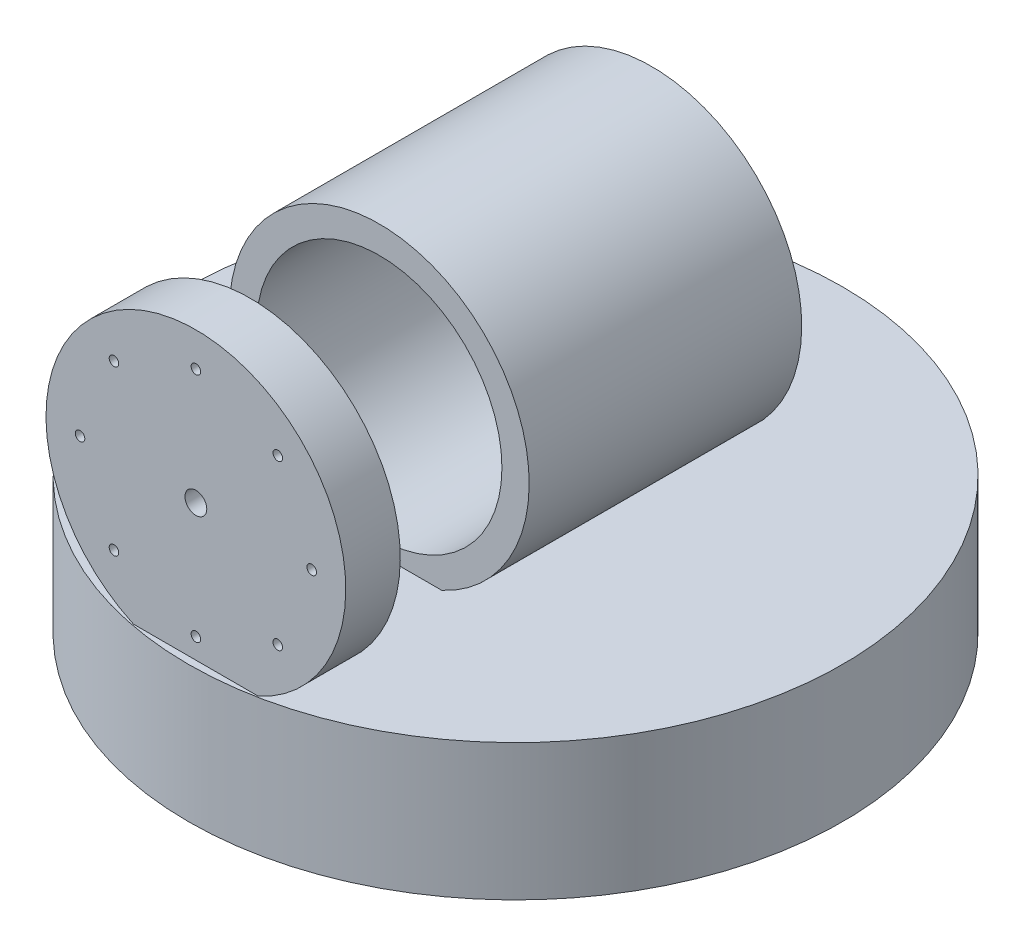
ISO-10303-21;
HEADER;
FILE_DESCRIPTION(('STEP AP214'),'2;1');
FILE_NAME('part.step','',(''),(''),'','','');
FILE_SCHEMA(('AUTOMOTIVE_DESIGN { 1 0 10303 214 1 1 1 1 }'));
ENDSEC;
DATA;
#1=APPLICATION_CONTEXT('core data for automotive mechanical design processes');
#2=APPLICATION_PROTOCOL_DEFINITION('international standard','automotive_design',2000,#1);
#3=PRODUCT_CONTEXT('',#1,'mechanical');
#4=PRODUCT('Part','Part','',(#3));
#5=PRODUCT_RELATED_PRODUCT_CATEGORY('part','',(#4));
#6=PRODUCT_DEFINITION_FORMATION('','',#4);
#7=PRODUCT_DEFINITION_CONTEXT('part definition',#1,'design');
#8=PRODUCT_DEFINITION('design','',#6,#7);
#9=PRODUCT_DEFINITION_SHAPE('','',#8);
#10=(LENGTH_UNIT() NAMED_UNIT(*) SI_UNIT(.MILLI.,.METRE.));
#11=(NAMED_UNIT(*) PLANE_ANGLE_UNIT() SI_UNIT($,.RADIAN.));
#12=(NAMED_UNIT(*) SI_UNIT($,.STERADIAN.) SOLID_ANGLE_UNIT());
#13=UNCERTAINTY_MEASURE_WITH_UNIT(LENGTH_MEASURE(1.E-05),#10,'distance_accuracy_value','');
#14=(GEOMETRIC_REPRESENTATION_CONTEXT(3) GLOBAL_UNCERTAINTY_ASSIGNED_CONTEXT((#13)) GLOBAL_UNIT_ASSIGNED_CONTEXT((#10,
#11,#12)) REPRESENTATION_CONTEXT('',''));
#15=CARTESIAN_POINT('',(0.,0.,0.));
#16=DIRECTION('',(0.,0.,1.));
#17=DIRECTION('',(1.,0.,0.));
#18=AXIS2_PLACEMENT_3D('',#15,#16,#17);
#19=CARTESIAN_POINT('',(0.,50.,0.));
#20=DIRECTION('',(0.,1.,0.));
#21=DIRECTION('',(0.,0.,1.));
#22=AXIS2_PLACEMENT_3D('',#19,#20,#21);
#23=PLANE('',#22);
#24=DIRECTION('',(1.,0.,0.));
#25=VECTOR('',#24,1.);
#26=CARTESIAN_POINT('',(0.,50.,117.3));
#27=LINE('',#26,#25);
#28=CARTESIAN_POINT('',(-22.9128784747792,50.,117.3));
#29=VERTEX_POINT('',#28);
#30=CARTESIAN_POINT('',(22.9128784747792,50.,117.3));
#31=VERTEX_POINT('',#30);
#32=EDGE_CURVE('E12',#29,#31,#27,.T.);
#33=ORIENTED_EDGE('',*,*,#32,.F.);
#34=DIRECTION('',(0.,0.,-1.));
#35=VECTOR('',#34,1.);
#36=CARTESIAN_POINT('',(-22.9128784747792,50.,117.3));
#37=LINE('',#36,#35);
#38=CARTESIAN_POINT('',(-22.9128784747792,50.,97.3));
#39=VERTEX_POINT('',#38);
#40=EDGE_CURVE('E96',#29,#39,#37,.T.);
#41=ORIENTED_EDGE('',*,*,#40,.T.);
#42=DIRECTION('',(1.,0.,0.));
#43=VECTOR('',#42,1.);
#44=CARTESIAN_POINT('',(0.,50.,97.3));
#45=LINE('',#44,#43);
#46=CARTESIAN_POINT('',(22.9128784747792,50.,97.3));
#47=VERTEX_POINT('',#46);
#48=EDGE_CURVE('E91',#39,#47,#45,.T.);
#49=ORIENTED_EDGE('',*,*,#48,.T.);
#50=DIRECTION('',(0.,0.,-1.));
#51=VECTOR('',#50,1.);
#52=CARTESIAN_POINT('',(22.9128784747792,50.,117.3));
#53=LINE('',#52,#51);
#54=EDGE_CURVE('E61',#47,#31,#53,.F.);
#55=ORIENTED_EDGE('',*,*,#54,.T.);
#56=EDGE_LOOP('',(#33,#41,#49,#55));
#57=FACE_BOUND('',#56,.T.);
#58=CARTESIAN_POINT('',(0.,50.,0.));
#59=DIRECTION('',(0.,1.,0.));
#60=DIRECTION('',(0.,0.,1.));
#61=AXIS2_PLACEMENT_3D('',#58,#59,#60);
#62=CIRCLE('',#61,120.);
#63=CARTESIAN_POINT('',(0.,50.,120.));
#64=VERTEX_POINT('',#63);
#65=EDGE_CURVE('E118',#64,#64,#62,.T.);
#66=ORIENTED_EDGE('',*,*,#65,.T.);
#67=EDGE_LOOP('',(#66));
#68=FACE_BOUND('',#67,.T.);
#69=DIRECTION('',(0.,0.,1.));
#70=VECTOR('',#69,1.);
#71=CARTESIAN_POINT('',(-22.9128784747792,50.,-50.));
#72=LINE('',#71,#70);
#73=CARTESIAN_POINT('',(-22.9128784747792,50.,-50.));
#74=VERTEX_POINT('',#73);
#75=CARTESIAN_POINT('',(-22.9128784747792,50.,50.));
#76=VERTEX_POINT('',#75);
#77=EDGE_CURVE('E75',#74,#76,#72,.T.);
#78=ORIENTED_EDGE('',*,*,#77,.F.);
#79=DIRECTION('',(1.,0.,0.));
#80=VECTOR('',#79,1.);
#81=CARTESIAN_POINT('',(0.,50.,-50.));
#82=LINE('',#81,#80);
#83=CARTESIAN_POINT('',(22.9128784747792,50.,-50.));
#84=VERTEX_POINT('',#83);
#85=EDGE_CURVE('E97',#74,#84,#82,.T.);
#86=ORIENTED_EDGE('',*,*,#85,.T.);
#87=DIRECTION('',(0.,0.,1.));
#88=VECTOR('',#87,1.);
#89=CARTESIAN_POINT('',(22.9128784747792,50.,-50.));
#90=LINE('',#89,#88);
#91=CARTESIAN_POINT('',(22.9128784747792,50.,50.));
#92=VERTEX_POINT('',#91);
#93=EDGE_CURVE('E112',#92,#84,#90,.F.);
#94=ORIENTED_EDGE('',*,*,#93,.F.);
#95=DIRECTION('',(1.,0.,0.));
#96=VECTOR('',#95,1.);
#97=CARTESIAN_POINT('',(0.,50.,50.));
#98=LINE('',#97,#96);
#99=EDGE_CURVE('E115',#76,#92,#98,.T.);
#100=ORIENTED_EDGE('',*,*,#99,.F.);
#101=EDGE_LOOP('',(#78,#86,#94,#100));
#102=FACE_BOUND('',#101,.T.);
#103=ADVANCED_FACE('F53',(#57,#68,#102),#23,.T.);
#104=CARTESIAN_POINT('',(0.,50.,0.));
#105=DIRECTION('',(0.,-1.,0.));
#106=DIRECTION('',(0.,0.,-1.));
#107=AXIS2_PLACEMENT_3D('',#104,#105,#106);
#108=CYLINDRICAL_SURFACE('',#107,120.);
#109=ORIENTED_EDGE('',*,*,#65,.F.);
#110=EDGE_LOOP('',(#109));
#111=FACE_BOUND('',#110,.T.);
#112=CARTESIAN_POINT('',(0.,0.,0.));
#113=DIRECTION('',(0.,1.,0.));
#114=DIRECTION('',(0.,0.,1.));
#115=AXIS2_PLACEMENT_3D('',#112,#113,#114);
#116=CIRCLE('',#115,120.);
#117=CARTESIAN_POINT('',(0.,0.,120.));
#118=VERTEX_POINT('',#117);
#119=EDGE_CURVE('E119',#118,#118,#116,.T.);
#120=ORIENTED_EDGE('',*,*,#119,.T.);
#121=EDGE_LOOP('',(#120));
#122=FACE_BOUND('',#121,.T.);
#123=ADVANCED_FACE('F55',(#111,#122),#108,.T.);
#124=CARTESIAN_POINT('',(0.,0.,0.));
#125=DIRECTION('',(0.,1.,0.));
#126=DIRECTION('',(0.,0.,1.));
#127=AXIS2_PLACEMENT_3D('',#124,#125,#126);
#128=PLANE('',#127);
#129=CARTESIAN_POINT('',(17.25,0.,0.));
#130=DIRECTION('',(0.,-1.,0.));
#131=DIRECTION('',(0.,0.,-1.));
#132=AXIS2_PLACEMENT_3D('',#129,#130,#131);
#133=CIRCLE('',#132,2.);
#134=CARTESIAN_POINT('',(17.25,0.,-2.));
#135=VERTEX_POINT('',#134);
#136=EDGE_CURVE('E162',#135,#135,#133,.T.);
#137=ORIENTED_EDGE('',*,*,#136,.F.);
#138=EDGE_LOOP('',(#137));
#139=FACE_BOUND('',#138,.T.);
#140=CARTESIAN_POINT('',(8.62500000000018,0.,14.9389382152815));
#141=DIRECTION('',(0.,-1.,0.));
#142=DIRECTION('',(0.,0.,-1.));
#143=AXIS2_PLACEMENT_3D('',#140,#141,#142);
#144=CIRCLE('',#143,2.);
#145=CARTESIAN_POINT('',(8.62500000000018,0.,12.9389382152815));
#146=VERTEX_POINT('',#145);
#147=EDGE_CURVE('E141',#146,#146,#144,.T.);
#148=ORIENTED_EDGE('',*,*,#147,.F.);
#149=EDGE_LOOP('',(#148));
#150=FACE_BOUND('',#149,.T.);
#151=CARTESIAN_POINT('',(-8.62499999999986,0.,14.9389382152816));
#152=DIRECTION('',(0.,-1.,0.));
#153=DIRECTION('',(0.,0.,-1.));
#154=AXIS2_PLACEMENT_3D('',#151,#152,#153);
#155=CIRCLE('',#154,2.);
#156=CARTESIAN_POINT('',(-8.62499999999986,0.,12.9389382152816));
#157=VERTEX_POINT('',#156);
#158=EDGE_CURVE('E140',#157,#157,#155,.T.);
#159=ORIENTED_EDGE('',*,*,#158,.F.);
#160=EDGE_LOOP('',(#159));
#161=FACE_BOUND('',#160,.T.);
#162=CARTESIAN_POINT('',(-17.25,0.,1.20456106190088E-13));
#163=DIRECTION('',(0.,-1.,0.));
#164=DIRECTION('',(0.,0.,-1.));
#165=AXIS2_PLACEMENT_3D('',#162,#163,#164);
#166=CIRCLE('',#165,2.);
#167=CARTESIAN_POINT('',(-17.25,0.,-1.99999999999988));
#168=VERTEX_POINT('',#167);
#169=EDGE_CURVE('E147',#168,#168,#166,.T.);
#170=ORIENTED_EDGE('',*,*,#169,.F.);
#171=EDGE_LOOP('',(#170));
#172=FACE_BOUND('',#171,.T.);
#173=CARTESIAN_POINT('',(-8.62500000000007,0.,-14.9389382152815));
#174=DIRECTION('',(0.,-1.,0.));
#175=DIRECTION('',(0.,0.,-1.));
#176=AXIS2_PLACEMENT_3D('',#173,#174,#175);
#177=CIRCLE('',#176,2.);
#178=CARTESIAN_POINT('',(-8.62500000000007,0.,-16.9389382152815));
#179=VERTEX_POINT('',#178);
#180=EDGE_CURVE('E153',#179,#179,#177,.T.);
#181=ORIENTED_EDGE('',*,*,#180,.F.);
#182=EDGE_LOOP('',(#181));
#183=FACE_BOUND('',#182,.T.);
#184=CARTESIAN_POINT('',(8.62499999999997,0.,-14.9389382152816));
#185=DIRECTION('',(0.,-1.,0.));
#186=DIRECTION('',(0.,0.,-1.));
#187=AXIS2_PLACEMENT_3D('',#184,#185,#186);
#188=CIRCLE('',#187,2.);
#189=CARTESIAN_POINT('',(8.62499999999997,0.,-16.9389382152816));
#190=VERTEX_POINT('',#189);
#191=EDGE_CURVE('E159',#190,#190,#188,.T.);
#192=ORIENTED_EDGE('',*,*,#191,.F.);
#193=EDGE_LOOP('',(#192));
#194=FACE_BOUND('',#193,.T.);
#195=ORIENTED_EDGE('',*,*,#119,.F.);
#196=EDGE_LOOP('',(#195));
#197=FACE_BOUND('',#196,.T.);
#198=ADVANCED_FACE('F262',(#139,#150,#161,#172,#183,#194,#197),#128,.F.);
#199=CARTESIAN_POINT('',(0.,100.,-50.));
#200=DIRECTION('',(0.,0.,1.));
#201=DIRECTION('',(1.,0.,0.));
#202=AXIS2_PLACEMENT_3D('',#199,#200,#201);
#203=CYLINDRICAL_SURFACE('',#202,55.);
#204=CARTESIAN_POINT('',(0.,100.,-50.));
#205=DIRECTION('',(0.,0.,1.));
#206=DIRECTION('',(1.,0.,0.));
#207=AXIS2_PLACEMENT_3D('',#204,#205,#206);
#208=CIRCLE('',#207,55.);
#209=EDGE_CURVE('E122',#84,#74,#208,.T.);
#210=ORIENTED_EDGE('',*,*,#209,.T.);
#211=ORIENTED_EDGE('',*,*,#77,.T.);
#212=CARTESIAN_POINT('',(0.,100.,50.));
#213=DIRECTION('',(0.,0.,1.));
#214=DIRECTION('',(1.,0.,0.));
#215=AXIS2_PLACEMENT_3D('',#212,#213,#214);
#216=CIRCLE('',#215,55.);
#217=EDGE_CURVE('E130',#92,#76,#216,.T.);
#218=ORIENTED_EDGE('',*,*,#217,.F.);
#219=ORIENTED_EDGE('',*,*,#93,.T.);
#220=EDGE_LOOP('',(#210,#211,#218,#219));
#221=FACE_BOUND('',#220,.T.);
#222=ADVANCED_FACE('F265',(#221),#203,.T.);
#223=CARTESIAN_POINT('',(0.,100.,-50.));
#224=DIRECTION('',(0.,0.,1.));
#225=DIRECTION('',(1.,0.,0.));
#226=AXIS2_PLACEMENT_3D('',#223,#224,#225);
#227=PLANE('',#226);
#228=ORIENTED_EDGE('',*,*,#85,.F.);
#229=ORIENTED_EDGE('',*,*,#209,.F.);
#230=EDGE_LOOP('',(#228,#229));
#231=FACE_BOUND('',#230,.T.);
#232=CARTESIAN_POINT('',(0.,100.,-50.));
#233=DIRECTION('',(0.,0.,1.));
#234=DIRECTION('',(1.,0.,0.));
#235=AXIS2_PLACEMENT_3D('',#232,#233,#234);
#236=CIRCLE('',#235,45.);
#237=CARTESIAN_POINT('',(45.,100.,-50.));
#238=VERTEX_POINT('',#237);
#239=EDGE_CURVE('E127',#238,#238,#236,.T.);
#240=ORIENTED_EDGE('',*,*,#239,.T.);
#241=EDGE_LOOP('',(#240));
#242=FACE_BOUND('',#241,.T.);
#243=ADVANCED_FACE('F274',(#231,#242),#227,.F.);
#244=CARTESIAN_POINT('',(0.,100.,-50.));
#245=DIRECTION('',(0.,0.,1.));
#246=DIRECTION('',(1.,0.,0.));
#247=AXIS2_PLACEMENT_3D('',#244,#245,#246);
#248=CYLINDRICAL_SURFACE('',#247,45.);
#249=ORIENTED_EDGE('',*,*,#239,.F.);
#250=EDGE_LOOP('',(#249));
#251=FACE_BOUND('',#250,.T.);
#252=CARTESIAN_POINT('',(0.,100.,50.));
#253=DIRECTION('',(0.,0.,1.));
#254=DIRECTION('',(1.,0.,0.));
#255=AXIS2_PLACEMENT_3D('',#252,#253,#254);
#256=CIRCLE('',#255,45.);
#257=CARTESIAN_POINT('',(45.,100.,50.));
#258=VERTEX_POINT('',#257);
#259=EDGE_CURVE('E133',#258,#258,#256,.T.);
#260=ORIENTED_EDGE('',*,*,#259,.T.);
#261=EDGE_LOOP('',(#260));
#262=FACE_BOUND('',#261,.T.);
#263=ADVANCED_FACE('F302',(#251,#262),#248,.F.);
#264=CARTESIAN_POINT('',(0.,100.,50.));
#265=DIRECTION('',(0.,0.,1.));
#266=DIRECTION('',(1.,0.,0.));
#267=AXIS2_PLACEMENT_3D('',#264,#265,#266);
#268=PLANE('',#267);
#269=ORIENTED_EDGE('',*,*,#217,.T.);
#270=ORIENTED_EDGE('',*,*,#99,.T.);
#271=EDGE_LOOP('',(#269,#270));
#272=FACE_BOUND('',#271,.T.);
#273=ORIENTED_EDGE('',*,*,#259,.F.);
#274=EDGE_LOOP('',(#273));
#275=FACE_BOUND('',#274,.T.);
#276=ADVANCED_FACE('F293',(#272,#275),#268,.T.);
#277=CARTESIAN_POINT('',(8.62499999999997,3.,-14.9389382152816));
#278=DIRECTION('',(0.,-1.,0.));
#279=DIRECTION('',(0.,0.,-1.));
#280=AXIS2_PLACEMENT_3D('',#277,#278,#279);
#281=CYLINDRICAL_SURFACE('',#280,2.);
#282=CARTESIAN_POINT('',(8.62499999999997,3.,-14.9389382152816));
#283=DIRECTION('',(0.,-1.,0.));
#284=DIRECTION('',(0.,0.,-1.));
#285=AXIS2_PLACEMENT_3D('',#282,#283,#284);
#286=CIRCLE('',#285,2.);
#287=CARTESIAN_POINT('',(8.62499999999997,3.,-16.9389382152816));
#288=VERTEX_POINT('',#287);
#289=EDGE_CURVE('E156',#288,#288,#286,.T.);
#290=ORIENTED_EDGE('',*,*,#289,.F.);
#291=EDGE_LOOP('',(#290));
#292=FACE_BOUND('',#291,.T.);
#293=ORIENTED_EDGE('',*,*,#191,.T.);
#294=EDGE_LOOP('',(#293));
#295=FACE_BOUND('',#294,.T.);
#296=ADVANCED_FACE('F291',(#292,#295),#281,.F.);
#297=CARTESIAN_POINT('',(8.62499999999997,3.,-14.9389382152816));
#298=DIRECTION('',(0.,-1.,0.));
#299=DIRECTION('',(0.,0.,-1.));
#300=AXIS2_PLACEMENT_3D('',#297,#298,#299);
#301=PLANE('',#300);
#302=ORIENTED_EDGE('',*,*,#289,.T.);
#303=EDGE_LOOP('',(#302));
#304=FACE_BOUND('',#303,.T.);
#305=ADVANCED_FACE('F292',(#304),#301,.T.);
#306=CARTESIAN_POINT('',(-8.62500000000007,3.,-14.9389382152815));
#307=DIRECTION('',(0.,-1.,0.));
#308=DIRECTION('',(0.,0.,-1.));
#309=AXIS2_PLACEMENT_3D('',#306,#307,#308);
#310=CYLINDRICAL_SURFACE('',#309,2.);
#311=CARTESIAN_POINT('',(-8.62500000000007,3.,-14.9389382152815));
#312=DIRECTION('',(0.,-1.,0.));
#313=DIRECTION('',(0.,0.,-1.));
#314=AXIS2_PLACEMENT_3D('',#311,#312,#313);
#315=CIRCLE('',#314,2.);
#316=CARTESIAN_POINT('',(-8.62500000000007,3.,-16.9389382152815));
#317=VERTEX_POINT('',#316);
#318=EDGE_CURVE('E150',#317,#317,#315,.T.);
#319=ORIENTED_EDGE('',*,*,#318,.F.);
#320=EDGE_LOOP('',(#319));
#321=FACE_BOUND('',#320,.T.);
#322=ORIENTED_EDGE('',*,*,#180,.T.);
#323=EDGE_LOOP('',(#322));
#324=FACE_BOUND('',#323,.T.);
#325=ADVANCED_FACE('F299',(#321,#324),#310,.F.);
#326=CARTESIAN_POINT('',(-8.62500000000007,3.,-14.9389382152815));
#327=DIRECTION('',(0.,-1.,0.));
#328=DIRECTION('',(0.,0.,-1.));
#329=AXIS2_PLACEMENT_3D('',#326,#327,#328);
#330=PLANE('',#329);
#331=ORIENTED_EDGE('',*,*,#318,.T.);
#332=EDGE_LOOP('',(#331));
#333=FACE_BOUND('',#332,.T.);
#334=ADVANCED_FACE('F312',(#333),#330,.T.);
#335=CARTESIAN_POINT('',(-17.25,3.,1.20456106190088E-13));
#336=DIRECTION('',(0.,-1.,0.));
#337=DIRECTION('',(0.,0.,-1.));
#338=AXIS2_PLACEMENT_3D('',#335,#336,#337);
#339=CYLINDRICAL_SURFACE('',#338,2.);
#340=CARTESIAN_POINT('',(-17.25,3.,1.20456106190088E-13));
#341=DIRECTION('',(0.,-1.,0.));
#342=DIRECTION('',(0.,0.,-1.));
#343=AXIS2_PLACEMENT_3D('',#340,#341,#342);
#344=CIRCLE('',#343,2.);
#345=CARTESIAN_POINT('',(-17.25,3.,-1.99999999999988));
#346=VERTEX_POINT('',#345);
#347=EDGE_CURVE('E144',#346,#346,#344,.T.);
#348=ORIENTED_EDGE('',*,*,#347,.F.);
#349=EDGE_LOOP('',(#348));
#350=FACE_BOUND('',#349,.T.);
#351=ORIENTED_EDGE('',*,*,#169,.T.);
#352=EDGE_LOOP('',(#351));
#353=FACE_BOUND('',#352,.T.);
#354=ADVANCED_FACE('F316',(#350,#353),#339,.F.);
#355=CARTESIAN_POINT('',(-17.25,3.,1.20456106190088E-13));
#356=DIRECTION('',(0.,-1.,0.));
#357=DIRECTION('',(0.,0.,-1.));
#358=AXIS2_PLACEMENT_3D('',#355,#356,#357);
#359=PLANE('',#358);
#360=ORIENTED_EDGE('',*,*,#347,.T.);
#361=EDGE_LOOP('',(#360));
#362=FACE_BOUND('',#361,.T.);
#363=ADVANCED_FACE('F320',(#362),#359,.T.);
#364=CARTESIAN_POINT('',(-8.62499999999986,3.,14.9389382152816));
#365=DIRECTION('',(0.,-1.,0.));
#366=DIRECTION('',(0.,0.,-1.));
#367=AXIS2_PLACEMENT_3D('',#364,#365,#366);
#368=CYLINDRICAL_SURFACE('',#367,2.);
#369=CARTESIAN_POINT('',(-8.62499999999986,3.,14.9389382152816));
#370=DIRECTION('',(0.,-1.,0.));
#371=DIRECTION('',(0.,0.,-1.));
#372=AXIS2_PLACEMENT_3D('',#369,#370,#371);
#373=CIRCLE('',#372,2.);
#374=CARTESIAN_POINT('',(-8.62499999999986,3.,12.9389382152816));
#375=VERTEX_POINT('',#374);
#376=EDGE_CURVE('E137',#375,#375,#373,.T.);
#377=ORIENTED_EDGE('',*,*,#376,.F.);
#378=EDGE_LOOP('',(#377));
#379=FACE_BOUND('',#378,.T.);
#380=ORIENTED_EDGE('',*,*,#158,.T.);
#381=EDGE_LOOP('',(#380));
#382=FACE_BOUND('',#381,.T.);
#383=ADVANCED_FACE('F324',(#379,#382),#368,.F.);
#384=CARTESIAN_POINT('',(-8.62499999999986,3.,14.9389382152816));
#385=DIRECTION('',(0.,-1.,0.));
#386=DIRECTION('',(0.,0.,-1.));
#387=AXIS2_PLACEMENT_3D('',#384,#385,#386);
#388=PLANE('',#387);
#389=ORIENTED_EDGE('',*,*,#376,.T.);
#390=EDGE_LOOP('',(#389));
#391=FACE_BOUND('',#390,.T.);
#392=ADVANCED_FACE('F328',(#391),#388,.T.);
#393=CARTESIAN_POINT('',(8.62500000000018,3.,14.9389382152815));
#394=DIRECTION('',(0.,-1.,0.));
#395=DIRECTION('',(0.,0.,-1.));
#396=AXIS2_PLACEMENT_3D('',#393,#394,#395);
#397=CYLINDRICAL_SURFACE('',#396,2.);
#398=CARTESIAN_POINT('',(8.62500000000018,3.,14.9389382152815));
#399=DIRECTION('',(0.,-1.,0.));
#400=DIRECTION('',(0.,0.,-1.));
#401=AXIS2_PLACEMENT_3D('',#398,#399,#400);
#402=CIRCLE('',#401,2.);
#403=CARTESIAN_POINT('',(8.62500000000018,3.,12.9389382152815));
#404=VERTEX_POINT('',#403);
#405=EDGE_CURVE('E163',#404,#404,#402,.T.);
#406=ORIENTED_EDGE('',*,*,#405,.F.);
#407=EDGE_LOOP('',(#406));
#408=FACE_BOUND('',#407,.T.);
#409=ORIENTED_EDGE('',*,*,#147,.T.);
#410=EDGE_LOOP('',(#409));
#411=FACE_BOUND('',#410,.T.);
#412=ADVANCED_FACE('F331',(#408,#411),#397,.F.);
#413=CARTESIAN_POINT('',(8.62500000000018,3.,14.9389382152815));
#414=DIRECTION('',(0.,-1.,0.));
#415=DIRECTION('',(0.,0.,-1.));
#416=AXIS2_PLACEMENT_3D('',#413,#414,#415);
#417=PLANE('',#416);
#418=ORIENTED_EDGE('',*,*,#405,.T.);
#419=EDGE_LOOP('',(#418));
#420=FACE_BOUND('',#419,.T.);
#421=ADVANCED_FACE('F307',(#420),#417,.T.);
#422=CARTESIAN_POINT('',(17.25,3.,0.));
#423=DIRECTION('',(0.,-1.,0.));
#424=DIRECTION('',(0.,0.,-1.));
#425=AXIS2_PLACEMENT_3D('',#422,#423,#424);
#426=CYLINDRICAL_SURFACE('',#425,2.);
#427=CARTESIAN_POINT('',(17.25,3.,0.));
#428=DIRECTION('',(0.,-1.,0.));
#429=DIRECTION('',(0.,0.,-1.));
#430=AXIS2_PLACEMENT_3D('',#427,#428,#429);
#431=CIRCLE('',#430,2.);
#432=CARTESIAN_POINT('',(17.25,3.,-2.));
#433=VERTEX_POINT('',#432);
#434=EDGE_CURVE('E136',#433,#433,#431,.T.);
#435=ORIENTED_EDGE('',*,*,#434,.F.);
#436=EDGE_LOOP('',(#435));
#437=FACE_BOUND('',#436,.T.);
#438=ORIENTED_EDGE('',*,*,#136,.T.);
#439=EDGE_LOOP('',(#438));
#440=FACE_BOUND('',#439,.T.);
#441=ADVANCED_FACE('F423',(#437,#440),#426,.F.);
#442=CARTESIAN_POINT('',(17.25,3.,0.));
#443=DIRECTION('',(0.,-1.,0.));
#444=DIRECTION('',(0.,0.,-1.));
#445=AXIS2_PLACEMENT_3D('',#442,#443,#444);
#446=PLANE('',#445);
#447=ORIENTED_EDGE('',*,*,#434,.T.);
#448=EDGE_LOOP('',(#447));
#449=FACE_BOUND('',#448,.T.);
#450=ADVANCED_FACE('F432',(#449),#446,.T.);
#451=CARTESIAN_POINT('',(0.,100.,117.3));
#452=DIRECTION('',(0.,0.,-1.));
#453=DIRECTION('',(-1.,0.,0.));
#454=AXIS2_PLACEMENT_3D('',#451,#452,#453);
#455=CYLINDRICAL_SURFACE('',#454,55.);
#456=ORIENTED_EDGE('',*,*,#54,.F.);
#457=CARTESIAN_POINT('',(0.,100.,97.3));
#458=DIRECTION('',(0.,0.,1.));
#459=DIRECTION('',(1.,0.,0.));
#460=AXIS2_PLACEMENT_3D('',#457,#458,#459);
#461=CIRCLE('',#460,55.);
#462=EDGE_CURVE('E67',#47,#39,#461,.T.);
#463=ORIENTED_EDGE('',*,*,#462,.T.);
#464=ORIENTED_EDGE('',*,*,#40,.F.);
#465=CARTESIAN_POINT('',(0.,100.,117.3));
#466=DIRECTION('',(0.,0.,1.));
#467=DIRECTION('',(1.,0.,0.));
#468=AXIS2_PLACEMENT_3D('',#465,#466,#467);
#469=CIRCLE('',#468,55.);
#470=EDGE_CURVE('E103',#31,#29,#469,.T.);
#471=ORIENTED_EDGE('',*,*,#470,.F.);
#472=EDGE_LOOP('',(#456,#463,#464,#471));
#473=FACE_BOUND('',#472,.T.);
#474=ADVANCED_FACE('F100',(#473),#455,.T.);
#475=CARTESIAN_POINT('',(0.,100.,117.3));
#476=DIRECTION('',(0.,0.,1.));
#477=DIRECTION('',(1.,0.,0.));
#478=AXIS2_PLACEMENT_3D('',#475,#476,#477);
#479=PLANE('',#478);
#480=CARTESIAN_POINT('',(-42.5,100.,117.3));
#481=DIRECTION('',(0.,0.,1.));
#482=DIRECTION('',(1.,0.,0.));
#483=AXIS2_PLACEMENT_3D('',#480,#481,#482);
#484=CIRCLE('',#483,1.75);
#485=CARTESIAN_POINT('',(-40.75,100.,117.3));
#486=VERTEX_POINT('',#485);
#487=EDGE_CURVE('E104',#486,#486,#484,.T.);
#488=ORIENTED_EDGE('',*,*,#487,.F.);
#489=EDGE_LOOP('',(#488));
#490=FACE_BOUND('',#489,.T.);
#491=CARTESIAN_POINT('',(-30.0520382004282,69.9479617995717,117.3));
#492=DIRECTION('',(0.,0.,1.));
#493=DIRECTION('',(1.,0.,0.));
#494=AXIS2_PLACEMENT_3D('',#491,#492,#493);
#495=CIRCLE('',#494,1.75000000000001);
#496=CARTESIAN_POINT('',(-28.3020382004282,69.9479617995717,117.3));
#497=VERTEX_POINT('',#496);
#498=EDGE_CURVE('E175',#497,#497,#495,.T.);
#499=ORIENTED_EDGE('',*,*,#498,.F.);
#500=EDGE_LOOP('',(#499));
#501=FACE_BOUND('',#500,.T.);
#502=CARTESIAN_POINT('',(1.66533453693773E-13,57.5,117.3));
#503=DIRECTION('',(0.,0.,1.));
#504=DIRECTION('',(1.,0.,0.));
#505=AXIS2_PLACEMENT_3D('',#502,#503,#504);
#506=CIRCLE('',#505,1.75000000000001);
#507=CARTESIAN_POINT('',(1.75000000000018,57.5,117.3));
#508=VERTEX_POINT('',#507);
#509=EDGE_CURVE('E178',#508,#508,#506,.T.);
#510=ORIENTED_EDGE('',*,*,#509,.F.);
#511=EDGE_LOOP('',(#510));
#512=FACE_BOUND('',#511,.T.);
#513=CARTESIAN_POINT('',(30.0520382004284,69.9479617995719,117.3));
#514=DIRECTION('',(0.,0.,1.));
#515=DIRECTION('',(1.,0.,0.));
#516=AXIS2_PLACEMENT_3D('',#513,#514,#515);
#517=CIRCLE('',#516,1.75);
#518=CARTESIAN_POINT('',(31.8020382004284,69.9479617995719,117.3));
#519=VERTEX_POINT('',#518);
#520=EDGE_CURVE('E181',#519,#519,#517,.T.);
#521=ORIENTED_EDGE('',*,*,#520,.F.);
#522=EDGE_LOOP('',(#521));
#523=FACE_BOUND('',#522,.T.);
#524=CARTESIAN_POINT('',(42.5,100.,117.3));
#525=DIRECTION('',(0.,0.,1.));
#526=DIRECTION('',(1.,0.,0.));
#527=AXIS2_PLACEMENT_3D('',#524,#525,#526);
#528=CIRCLE('',#527,1.75);
#529=CARTESIAN_POINT('',(44.25,100.,117.3));
#530=VERTEX_POINT('',#529);
#531=EDGE_CURVE('E184',#530,#530,#528,.T.);
#532=ORIENTED_EDGE('',*,*,#531,.F.);
#533=EDGE_LOOP('',(#532));
#534=FACE_BOUND('',#533,.T.);
#535=CARTESIAN_POINT('',(30.052038200428,130.052038200429,117.3));
#536=DIRECTION('',(0.,0.,1.));
#537=DIRECTION('',(1.,0.,0.));
#538=AXIS2_PLACEMENT_3D('',#535,#536,#537);
#539=CIRCLE('',#538,1.75000000000001);
#540=CARTESIAN_POINT('',(31.802038200428,130.052038200429,117.3));
#541=VERTEX_POINT('',#540);
#542=EDGE_CURVE('E187',#541,#541,#539,.T.);
#543=ORIENTED_EDGE('',*,*,#542,.F.);
#544=EDGE_LOOP('',(#543));
#545=FACE_BOUND('',#544,.T.);
#546=CARTESIAN_POINT('',(-4.44089209850063E-13,142.5,117.3));
#547=DIRECTION('',(0.,0.,1.));
#548=DIRECTION('',(1.,0.,0.));
#549=AXIS2_PLACEMENT_3D('',#546,#547,#548);
#550=CIRCLE('',#549,1.75000000000001);
#551=CARTESIAN_POINT('',(1.74999999999956,142.5,117.3));
#552=VERTEX_POINT('',#551);
#553=EDGE_CURVE('E190',#552,#552,#550,.T.);
#554=ORIENTED_EDGE('',*,*,#553,.F.);
#555=EDGE_LOOP('',(#554));
#556=FACE_BOUND('',#555,.T.);
#557=CARTESIAN_POINT('',(-30.0520382004286,130.052038200428,117.3));
#558=DIRECTION('',(0.,0.,1.));
#559=DIRECTION('',(1.,0.,0.));
#560=AXIS2_PLACEMENT_3D('',#557,#558,#559);
#561=CIRCLE('',#560,1.75000000000001);
#562=CARTESIAN_POINT('',(-28.3020382004286,130.052038200428,117.3));
#563=VERTEX_POINT('',#562);
#564=EDGE_CURVE('E193',#563,#563,#561,.T.);
#565=ORIENTED_EDGE('',*,*,#564,.F.);
#566=EDGE_LOOP('',(#565));
#567=FACE_BOUND('',#566,.T.);
#568=CARTESIAN_POINT('',(0.,100.,117.3));
#569=DIRECTION('',(0.,0.,1.));
#570=DIRECTION('',(1.,0.,0.));
#571=AXIS2_PLACEMENT_3D('',#568,#569,#570);
#572=CIRCLE('',#571,4.);
#573=CARTESIAN_POINT('',(4.,100.,117.3));
#574=VERTEX_POINT('',#573);
#575=EDGE_CURVE('E196',#574,#574,#572,.T.);
#576=ORIENTED_EDGE('',*,*,#575,.F.);
#577=EDGE_LOOP('',(#576));
#578=FACE_BOUND('',#577,.T.);
#579=ORIENTED_EDGE('',*,*,#470,.T.);
#580=ORIENTED_EDGE('',*,*,#32,.T.);
#581=EDGE_LOOP('',(#579,#580));
#582=FACE_BOUND('',#581,.T.);
#583=ADVANCED_FACE('F232',(#490,#501,#512,#523,#534,#545,#556,#567,#578,#582),#479,.T.);
#584=CARTESIAN_POINT('',(0.,100.,97.3));
#585=DIRECTION('',(0.,0.,1.));
#586=DIRECTION('',(1.,0.,0.));
#587=AXIS2_PLACEMENT_3D('',#584,#585,#586);
#588=PLANE('',#587);
#589=CARTESIAN_POINT('',(-42.5,100.,97.3));
#590=DIRECTION('',(0.,0.,-1.));
#591=DIRECTION('',(-1.,0.,0.));
#592=AXIS2_PLACEMENT_3D('',#589,#590,#591);
#593=CIRCLE('',#592,1.75);
#594=CARTESIAN_POINT('',(-44.25,100.,97.3));
#595=VERTEX_POINT('',#594);
#596=EDGE_CURVE('E202',#595,#595,#593,.T.);
#597=ORIENTED_EDGE('',*,*,#596,.F.);
#598=EDGE_LOOP('',(#597));
#599=FACE_BOUND('',#598,.T.);
#600=CARTESIAN_POINT('',(-30.0520382004282,69.9479617995717,97.3));
#601=DIRECTION('',(0.,0.,-1.));
#602=DIRECTION('',(-1.,0.,0.));
#603=AXIS2_PLACEMENT_3D('',#600,#601,#602);
#604=CIRCLE('',#603,1.75000000000001);
#605=CARTESIAN_POINT('',(-31.8020382004282,69.9479617995717,97.3));
#606=VERTEX_POINT('',#605);
#607=EDGE_CURVE('E210',#606,#606,#604,.T.);
#608=ORIENTED_EDGE('',*,*,#607,.F.);
#609=EDGE_LOOP('',(#608));
#610=FACE_BOUND('',#609,.T.);
#611=CARTESIAN_POINT('',(1.66533453693773E-13,57.5,97.3));
#612=DIRECTION('',(0.,0.,-1.));
#613=DIRECTION('',(-1.,0.,0.));
#614=AXIS2_PLACEMENT_3D('',#611,#612,#613);
#615=CIRCLE('',#614,1.75000000000001);
#616=CARTESIAN_POINT('',(-1.74999999999984,57.5,97.3));
#617=VERTEX_POINT('',#616);
#618=EDGE_CURVE('E206',#617,#617,#615,.T.);
#619=ORIENTED_EDGE('',*,*,#618,.F.);
#620=EDGE_LOOP('',(#619));
#621=FACE_BOUND('',#620,.T.);
#622=CARTESIAN_POINT('',(30.0520382004284,69.9479617995719,97.3));
#623=DIRECTION('',(0.,0.,-1.));
#624=DIRECTION('',(-1.,0.,0.));
#625=AXIS2_PLACEMENT_3D('',#622,#623,#624);
#626=CIRCLE('',#625,1.75);
#627=CARTESIAN_POINT('',(28.3020382004284,69.9479617995719,97.3));
#628=VERTEX_POINT('',#627);
#629=EDGE_CURVE('E203',#628,#628,#626,.T.);
#630=ORIENTED_EDGE('',*,*,#629,.F.);
#631=EDGE_LOOP('',(#630));
#632=FACE_BOUND('',#631,.T.);
#633=CARTESIAN_POINT('',(42.5,100.,97.3));
#634=DIRECTION('',(0.,0.,-1.));
#635=DIRECTION('',(-1.,0.,0.));
#636=AXIS2_PLACEMENT_3D('',#633,#634,#635);
#637=CIRCLE('',#636,1.75);
#638=CARTESIAN_POINT('',(40.75,100.,97.3));
#639=VERTEX_POINT('',#638);
#640=EDGE_CURVE('E207',#639,#639,#637,.T.);
#641=ORIENTED_EDGE('',*,*,#640,.F.);
#642=EDGE_LOOP('',(#641));
#643=FACE_BOUND('',#642,.T.);
#644=CARTESIAN_POINT('',(30.052038200428,130.052038200429,97.3));
#645=DIRECTION('',(0.,0.,-1.));
#646=DIRECTION('',(-1.,0.,0.));
#647=AXIS2_PLACEMENT_3D('',#644,#645,#646);
#648=CIRCLE('',#647,1.75000000000001);
#649=CARTESIAN_POINT('',(28.302038200428,130.052038200429,97.3));
#650=VERTEX_POINT('',#649);
#651=EDGE_CURVE('E221',#650,#650,#648,.T.);
#652=ORIENTED_EDGE('',*,*,#651,.F.);
#653=EDGE_LOOP('',(#652));
#654=FACE_BOUND('',#653,.T.);
#655=CARTESIAN_POINT('',(-4.44089209850063E-13,142.5,97.3));
#656=DIRECTION('',(0.,0.,-1.));
#657=DIRECTION('',(-1.,0.,0.));
#658=AXIS2_PLACEMENT_3D('',#655,#656,#657);
#659=CIRCLE('',#658,1.75000000000001);
#660=CARTESIAN_POINT('',(-1.75000000000045,142.5,97.3));
#661=VERTEX_POINT('',#660);
#662=EDGE_CURVE('E218',#661,#661,#659,.T.);
#663=ORIENTED_EDGE('',*,*,#662,.F.);
#664=EDGE_LOOP('',(#663));
#665=FACE_BOUND('',#664,.T.);
#666=CARTESIAN_POINT('',(-30.0520382004286,130.052038200428,97.3));
#667=DIRECTION('',(0.,0.,-1.));
#668=DIRECTION('',(-1.,0.,0.));
#669=AXIS2_PLACEMENT_3D('',#666,#667,#668);
#670=CIRCLE('',#669,1.75000000000001);
#671=CARTESIAN_POINT('',(-31.8020382004287,130.052038200428,97.3));
#672=VERTEX_POINT('',#671);
#673=EDGE_CURVE('E215',#672,#672,#670,.T.);
#674=ORIENTED_EDGE('',*,*,#673,.F.);
#675=EDGE_LOOP('',(#674));
#676=FACE_BOUND('',#675,.T.);
#677=CARTESIAN_POINT('',(0.,100.,97.3));
#678=DIRECTION('',(0.,0.,-1.));
#679=DIRECTION('',(-1.,0.,0.));
#680=AXIS2_PLACEMENT_3D('',#677,#678,#679);
#681=CIRCLE('',#680,4.);
#682=CARTESIAN_POINT('',(-4.,100.,97.3));
#683=VERTEX_POINT('',#682);
#684=EDGE_CURVE('E199',#683,#683,#681,.T.);
#685=ORIENTED_EDGE('',*,*,#684,.F.);
#686=EDGE_LOOP('',(#685));
#687=FACE_BOUND('',#686,.T.);
#688=ORIENTED_EDGE('',*,*,#48,.F.);
#689=ORIENTED_EDGE('',*,*,#462,.F.);
#690=EDGE_LOOP('',(#688,#689));
#691=FACE_BOUND('',#690,.T.);
#692=ADVANCED_FACE('F92',(#599,#610,#621,#632,#643,#654,#665,#676,#687,#691),#588,.F.);
#693=CARTESIAN_POINT('',(0.,100.,120.));
#694=DIRECTION('',(0.,0.,-1.));
#695=DIRECTION('',(-1.,0.,0.));
#696=AXIS2_PLACEMENT_3D('',#693,#694,#695);
#697=CYLINDRICAL_SURFACE('',#696,4.);
#698=ORIENTED_EDGE('',*,*,#575,.T.);
#699=EDGE_LOOP('',(#698));
#700=FACE_BOUND('',#699,.T.);
#701=ORIENTED_EDGE('',*,*,#684,.T.);
#702=EDGE_LOOP('',(#701));
#703=FACE_BOUND('',#702,.T.);
#704=ADVANCED_FACE('F231',(#700,#703),#697,.F.);
#705=CARTESIAN_POINT('',(-30.0520382004286,130.052038200428,120.));
#706=DIRECTION('',(0.,0.,-1.));
#707=DIRECTION('',(-1.,0.,0.));
#708=AXIS2_PLACEMENT_3D('',#705,#706,#707);
#709=CYLINDRICAL_SURFACE('',#708,1.75000000000001);
#710=ORIENTED_EDGE('',*,*,#564,.T.);
#711=EDGE_LOOP('',(#710));
#712=FACE_BOUND('',#711,.T.);
#713=ORIENTED_EDGE('',*,*,#673,.T.);
#714=EDGE_LOOP('',(#713));
#715=FACE_BOUND('',#714,.T.);
#716=ADVANCED_FACE('F244',(#712,#715),#709,.F.);
#717=CARTESIAN_POINT('',(-4.44089209850063E-13,142.5,120.));
#718=DIRECTION('',(0.,0.,-1.));
#719=DIRECTION('',(-1.,0.,0.));
#720=AXIS2_PLACEMENT_3D('',#717,#718,#719);
#721=CYLINDRICAL_SURFACE('',#720,1.75000000000001);
#722=ORIENTED_EDGE('',*,*,#553,.T.);
#723=EDGE_LOOP('',(#722));
#724=FACE_BOUND('',#723,.T.);
#725=ORIENTED_EDGE('',*,*,#662,.T.);
#726=EDGE_LOOP('',(#725));
#727=FACE_BOUND('',#726,.T.);
#728=ADVANCED_FACE('F250',(#724,#727),#721,.F.);
#729=CARTESIAN_POINT('',(30.052038200428,130.052038200429,120.));
#730=DIRECTION('',(0.,0.,-1.));
#731=DIRECTION('',(-1.,0.,0.));
#732=AXIS2_PLACEMENT_3D('',#729,#730,#731);
#733=CYLINDRICAL_SURFACE('',#732,1.75000000000001);
#734=ORIENTED_EDGE('',*,*,#542,.T.);
#735=EDGE_LOOP('',(#734));
#736=FACE_BOUND('',#735,.T.);
#737=ORIENTED_EDGE('',*,*,#651,.T.);
#738=EDGE_LOOP('',(#737));
#739=FACE_BOUND('',#738,.T.);
#740=ADVANCED_FACE('F481',(#736,#739),#733,.F.);
#741=CARTESIAN_POINT('',(42.5,100.,120.));
#742=DIRECTION('',(0.,0.,-1.));
#743=DIRECTION('',(-1.,0.,0.));
#744=AXIS2_PLACEMENT_3D('',#741,#742,#743);
#745=CYLINDRICAL_SURFACE('',#744,1.75);
#746=ORIENTED_EDGE('',*,*,#531,.T.);
#747=EDGE_LOOP('',(#746));
#748=FACE_BOUND('',#747,.T.);
#749=ORIENTED_EDGE('',*,*,#640,.T.);
#750=EDGE_LOOP('',(#749));
#751=FACE_BOUND('',#750,.T.);
#752=ADVANCED_FACE('F227',(#748,#751),#745,.F.);
#753=CARTESIAN_POINT('',(30.0520382004284,69.9479617995719,120.));
#754=DIRECTION('',(0.,0.,-1.));
#755=DIRECTION('',(-1.,0.,0.));
#756=AXIS2_PLACEMENT_3D('',#753,#754,#755);
#757=CYLINDRICAL_SURFACE('',#756,1.75);
#758=ORIENTED_EDGE('',*,*,#520,.T.);
#759=EDGE_LOOP('',(#758));
#760=FACE_BOUND('',#759,.T.);
#761=ORIENTED_EDGE('',*,*,#629,.T.);
#762=EDGE_LOOP('',(#761));
#763=FACE_BOUND('',#762,.T.);
#764=ADVANCED_FACE('F500',(#760,#763),#757,.F.);
#765=CARTESIAN_POINT('',(1.66533453693773E-13,57.5,120.));
#766=DIRECTION('',(0.,0.,-1.));
#767=DIRECTION('',(-1.,0.,0.));
#768=AXIS2_PLACEMENT_3D('',#765,#766,#767);
#769=CYLINDRICAL_SURFACE('',#768,1.75000000000001);
#770=ORIENTED_EDGE('',*,*,#509,.T.);
#771=EDGE_LOOP('',(#770));
#772=FACE_BOUND('',#771,.T.);
#773=ORIENTED_EDGE('',*,*,#618,.T.);
#774=EDGE_LOOP('',(#773));
#775=FACE_BOUND('',#774,.T.);
#776=ADVANCED_FACE('F510',(#772,#775),#769,.F.);
#777=CARTESIAN_POINT('',(-30.0520382004282,69.9479617995717,120.));
#778=DIRECTION('',(0.,0.,-1.));
#779=DIRECTION('',(-1.,0.,0.));
#780=AXIS2_PLACEMENT_3D('',#777,#778,#779);
#781=CYLINDRICAL_SURFACE('',#780,1.75000000000001);
#782=ORIENTED_EDGE('',*,*,#498,.T.);
#783=EDGE_LOOP('',(#782));
#784=FACE_BOUND('',#783,.T.);
#785=ORIENTED_EDGE('',*,*,#607,.T.);
#786=EDGE_LOOP('',(#785));
#787=FACE_BOUND('',#786,.T.);
#788=ADVANCED_FACE('F519',(#784,#787),#781,.F.);
#789=CARTESIAN_POINT('',(-42.5,100.,120.));
#790=DIRECTION('',(0.,0.,-1.));
#791=DIRECTION('',(-1.,0.,0.));
#792=AXIS2_PLACEMENT_3D('',#789,#790,#791);
#793=CYLINDRICAL_SURFACE('',#792,1.75);
#794=ORIENTED_EDGE('',*,*,#487,.T.);
#795=EDGE_LOOP('',(#794));
#796=FACE_BOUND('',#795,.T.);
#797=ORIENTED_EDGE('',*,*,#596,.T.);
#798=EDGE_LOOP('',(#797));
#799=FACE_BOUND('',#798,.T.);
#800=ADVANCED_FACE('F529',(#796,#799),#793,.F.);
#801=CLOSED_SHELL('',(#103,#123,#198,#222,#243,#263,#276,#296,#305,#325,#334,#354,#363,#383,
#392,#412,#421,#441,#450,#474,#583,#692,#704,#716,#728,#740,#752,#764,#776,#788,#800));
#802=MANIFOLD_SOLID_BREP('B2',#801);
#803=ADVANCED_BREP_SHAPE_REPRESENTATION('',(#18,#802),#14);
#804=SHAPE_DEFINITION_REPRESENTATION(#9,#803);
ENDSEC;
END-ISO-10303-21;
